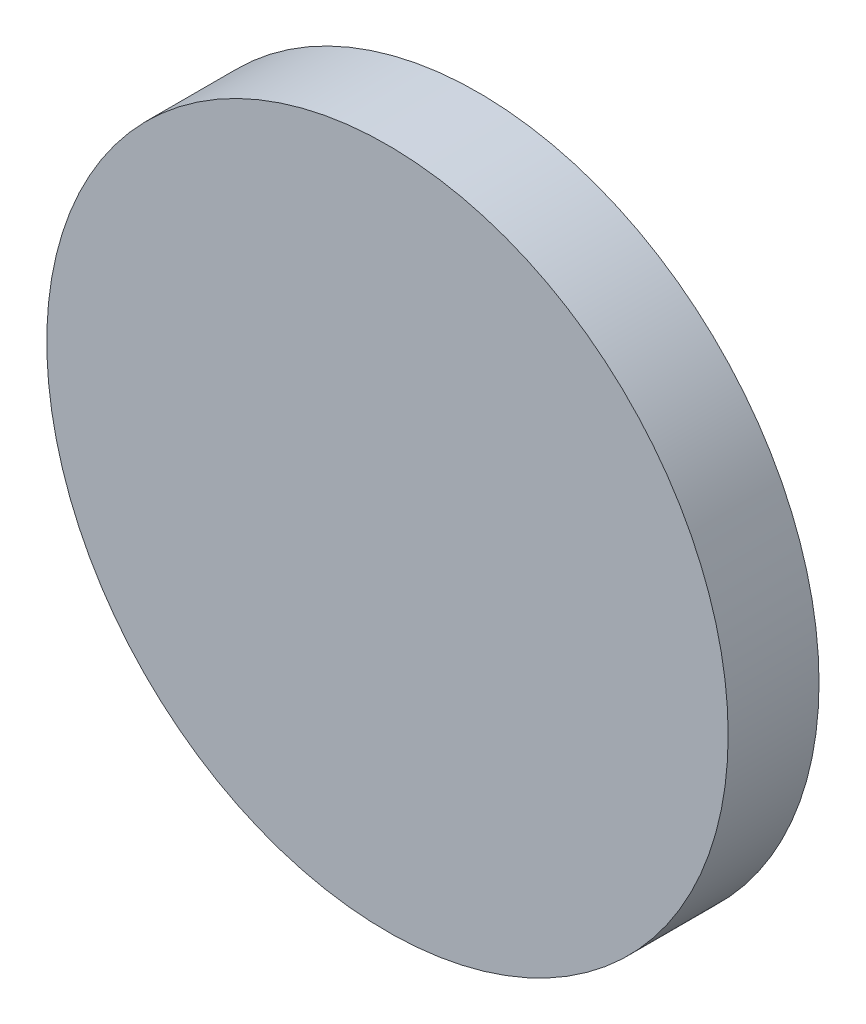
ISO-10303-21;
HEADER;
FILE_DESCRIPTION(('STEP AP214'),'2;1');
FILE_NAME('part.step','',(''),(''),'','','');
FILE_SCHEMA(('AUTOMOTIVE_DESIGN { 1 0 10303 214 1 1 1 1 }'));
ENDSEC;
DATA;
#1=APPLICATION_CONTEXT('core data for automotive mechanical design processes');
#2=APPLICATION_PROTOCOL_DEFINITION('international standard','automotive_design',2000,#1);
#3=PRODUCT_CONTEXT('',#1,'mechanical');
#4=PRODUCT('Part','Part','',(#3));
#5=PRODUCT_RELATED_PRODUCT_CATEGORY('part','',(#4));
#6=PRODUCT_DEFINITION_FORMATION('','',#4);
#7=PRODUCT_DEFINITION_CONTEXT('part definition',#1,'design');
#8=PRODUCT_DEFINITION('design','',#6,#7);
#9=PRODUCT_DEFINITION_SHAPE('','',#8);
#10=(LENGTH_UNIT() NAMED_UNIT(*) SI_UNIT(.MILLI.,.METRE.));
#11=(NAMED_UNIT(*) PLANE_ANGLE_UNIT() SI_UNIT($,.RADIAN.));
#12=(NAMED_UNIT(*) SI_UNIT($,.STERADIAN.) SOLID_ANGLE_UNIT());
#13=UNCERTAINTY_MEASURE_WITH_UNIT(LENGTH_MEASURE(1.E-05),#10,'distance_accuracy_value','');
#14=(GEOMETRIC_REPRESENTATION_CONTEXT(3) GLOBAL_UNCERTAINTY_ASSIGNED_CONTEXT((#13)) GLOBAL_UNIT_ASSIGNED_CONTEXT((#10,
#11,#12)) REPRESENTATION_CONTEXT('',''));
#15=CARTESIAN_POINT('',(0.,0.,0.));
#16=DIRECTION('',(0.,0.,1.));
#17=DIRECTION('',(1.,0.,0.));
#18=AXIS2_PLACEMENT_3D('',#15,#16,#17);
#19=CARTESIAN_POINT('',(0.,0.,0.));
#20=DIRECTION('',(0.,0.,1.));
#21=DIRECTION('',(1.,0.,0.));
#22=AXIS2_PLACEMENT_3D('',#19,#20,#21);
#23=PLANE('',#22);
#24=CARTESIAN_POINT('',(0.,0.,0.));
#25=DIRECTION('',(0.,0.,1.));
#26=DIRECTION('',(1.,0.,0.));
#27=AXIS2_PLACEMENT_3D('',#24,#25,#26);
#28=CIRCLE('',#27,4.5);
#29=CARTESIAN_POINT('',(4.5,0.,0.));
#30=VERTEX_POINT('',#29);
#31=EDGE_CURVE('E40',#30,#30,#28,.T.);
#32=ORIENTED_EDGE('',*,*,#31,.F.);
#33=EDGE_LOOP('',(#32));
#34=FACE_BOUND('',#33,.T.);
#35=CARTESIAN_POINT('',(0.,0.,0.));
#36=DIRECTION('',(0.,0.,1.));
#37=DIRECTION('',(1.,0.,0.));
#38=AXIS2_PLACEMENT_3D('',#35,#36,#37);
#39=CIRCLE('',#38,3.5);
#40=CARTESIAN_POINT('',(3.5,0.,0.));
#41=VERTEX_POINT('',#40);
#42=EDGE_CURVE('E47',#41,#41,#39,.T.);
#43=ORIENTED_EDGE('',*,*,#42,.T.);
#44=EDGE_LOOP('',(#43));
#45=FACE_BOUND('',#44,.T.);
#46=ADVANCED_FACE('F36',(#34,#45),#23,.F.);
#47=CARTESIAN_POINT('',(0.,0.,2.));
#48=DIRECTION('',(0.,0.,-1.));
#49=DIRECTION('',(-1.,0.,0.));
#50=AXIS2_PLACEMENT_3D('',#47,#48,#49);
#51=CYLINDRICAL_SURFACE('',#50,4.5);
#52=CARTESIAN_POINT('',(0.,0.,2.));
#53=DIRECTION('',(0.,0.,1.));
#54=DIRECTION('',(1.,0.,0.));
#55=AXIS2_PLACEMENT_3D('',#52,#53,#54);
#56=CIRCLE('',#55,4.5);
#57=CARTESIAN_POINT('',(4.5,0.,2.));
#58=VERTEX_POINT('',#57);
#59=EDGE_CURVE('E10',#58,#58,#56,.T.);
#60=ORIENTED_EDGE('',*,*,#59,.F.);
#61=EDGE_LOOP('',(#60));
#62=FACE_BOUND('',#61,.T.);
#63=ORIENTED_EDGE('',*,*,#31,.T.);
#64=EDGE_LOOP('',(#63));
#65=FACE_BOUND('',#64,.T.);
#66=ADVANCED_FACE('F38',(#62,#65),#51,.T.);
#67=CARTESIAN_POINT('',(0.,0.,2.));
#68=DIRECTION('',(0.,0.,-1.));
#69=DIRECTION('',(-1.,0.,0.));
#70=AXIS2_PLACEMENT_3D('',#67,#68,#69);
#71=CYLINDRICAL_SURFACE('',#70,3.5);
#72=CARTESIAN_POINT('',(0.,0.,2.));
#73=DIRECTION('',(0.,0.,1.));
#74=DIRECTION('',(1.,0.,0.));
#75=AXIS2_PLACEMENT_3D('',#72,#73,#74);
#76=CIRCLE('',#75,3.5);
#77=CARTESIAN_POINT('',(3.5,0.,2.));
#78=VERTEX_POINT('',#77);
#79=EDGE_CURVE('E51',#78,#78,#76,.T.);
#80=ORIENTED_EDGE('',*,*,#79,.T.);
#81=EDGE_LOOP('',(#80));
#82=FACE_BOUND('',#81,.T.);
#83=ORIENTED_EDGE('',*,*,#42,.F.);
#84=EDGE_LOOP('',(#83));
#85=FACE_BOUND('',#84,.T.);
#86=ADVANCED_FACE('F78',(#82,#85),#71,.F.);
#87=CARTESIAN_POINT('',(0.,0.,2.));
#88=DIRECTION('',(0.,0.,1.));
#89=DIRECTION('',(1.,0.,0.));
#90=AXIS2_PLACEMENT_3D('',#87,#88,#89);
#91=PLANE('',#90);
#92=ORIENTED_EDGE('',*,*,#79,.F.);
#93=EDGE_LOOP('',(#92));
#94=FACE_BOUND('',#93,.T.);
#95=ADVANCED_FACE('F66',(#94),#91,.F.);
#96=CARTESIAN_POINT('',(0.,0.,4.));
#97=DIRECTION('',(0.,0.,-1.));
#98=DIRECTION('',(-1.,0.,0.));
#99=AXIS2_PLACEMENT_3D('',#96,#97,#98);
#100=CYLINDRICAL_SURFACE('',#99,7.5);
#101=CARTESIAN_POINT('',(0.,0.,4.));
#102=DIRECTION('',(0.,0.,1.));
#103=DIRECTION('',(1.,0.,0.));
#104=AXIS2_PLACEMENT_3D('',#101,#102,#103);
#105=CIRCLE('',#104,7.5);
#106=CARTESIAN_POINT('',(7.5,0.,4.));
#107=VERTEX_POINT('',#106);
#108=EDGE_CURVE('E54',#107,#107,#105,.T.);
#109=ORIENTED_EDGE('',*,*,#108,.F.);
#110=EDGE_LOOP('',(#109));
#111=FACE_BOUND('',#110,.T.);
#112=CARTESIAN_POINT('',(0.,0.,2.));
#113=DIRECTION('',(0.,0.,1.));
#114=DIRECTION('',(1.,0.,0.));
#115=AXIS2_PLACEMENT_3D('',#112,#113,#114);
#116=CIRCLE('',#115,7.5);
#117=CARTESIAN_POINT('',(7.5,0.,2.));
#118=VERTEX_POINT('',#117);
#119=EDGE_CURVE('E55',#118,#118,#116,.T.);
#120=ORIENTED_EDGE('',*,*,#119,.T.);
#121=EDGE_LOOP('',(#120));
#122=FACE_BOUND('',#121,.T.);
#123=ADVANCED_FACE('F63',(#111,#122),#100,.T.);
#124=CARTESIAN_POINT('',(0.,0.,4.));
#125=DIRECTION('',(0.,0.,1.));
#126=DIRECTION('',(1.,0.,0.));
#127=AXIS2_PLACEMENT_3D('',#124,#125,#126);
#128=PLANE('',#127);
#129=ORIENTED_EDGE('',*,*,#108,.T.);
#130=EDGE_LOOP('',(#129));
#131=FACE_BOUND('',#130,.T.);
#132=ADVANCED_FACE('F61',(#131),#128,.T.);
#133=ORIENTED_EDGE('',*,*,#59,.T.);
#134=EDGE_LOOP('',(#133));
#135=FACE_BOUND('',#134,.T.);
#136=ORIENTED_EDGE('',*,*,#119,.F.);
#137=EDGE_LOOP('',(#136));
#138=FACE_BOUND('',#137,.T.);
#139=ADVANCED_FACE('F70',(#135,#138),#91,.F.);
#140=CLOSED_SHELL('',(#46,#66,#86,#95,#123,#132,#139));
#141=MANIFOLD_SOLID_BREP('B2',#140);
#142=ADVANCED_BREP_SHAPE_REPRESENTATION('',(#18,#141),#14);
#143=SHAPE_DEFINITION_REPRESENTATION(#9,#142);
ENDSEC;
END-ISO-10303-21;
